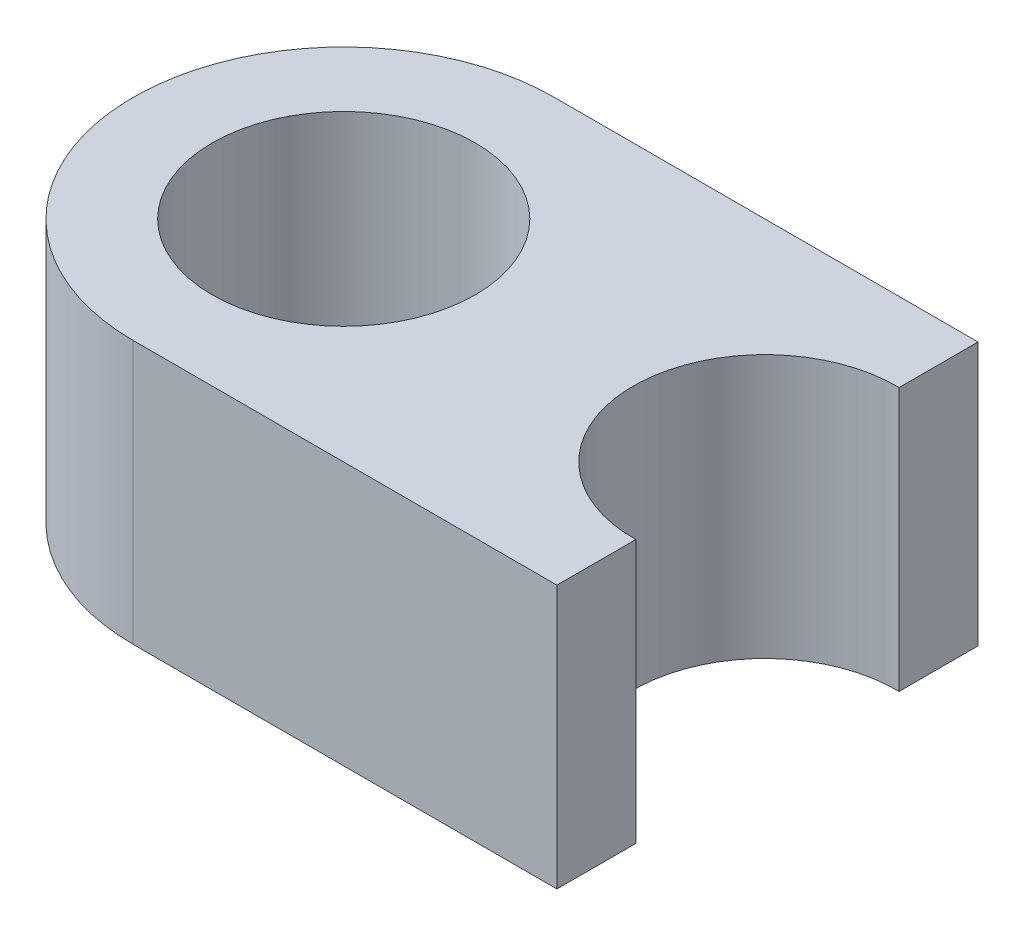
ISO-10303-21;
HEADER;
FILE_DESCRIPTION(('STEP AP214'),'2;1');
FILE_NAME('part.step','',(''),(''),'','','');
FILE_SCHEMA(('AUTOMOTIVE_DESIGN { 1 0 10303 214 1 1 1 1 }'));
ENDSEC;
DATA;
#1=APPLICATION_CONTEXT('core data for automotive mechanical design processes');
#2=APPLICATION_PROTOCOL_DEFINITION('international standard','automotive_design',2000,#1);
#3=PRODUCT_CONTEXT('',#1,'mechanical');
#4=PRODUCT('Part','Part','',(#3));
#5=PRODUCT_RELATED_PRODUCT_CATEGORY('part','',(#4));
#6=PRODUCT_DEFINITION_FORMATION('','',#4);
#7=PRODUCT_DEFINITION_CONTEXT('part definition',#1,'design');
#8=PRODUCT_DEFINITION('design','',#6,#7);
#9=PRODUCT_DEFINITION_SHAPE('','',#8);
#10=(LENGTH_UNIT() NAMED_UNIT(*) SI_UNIT(.MILLI.,.METRE.));
#11=(NAMED_UNIT(*) PLANE_ANGLE_UNIT() SI_UNIT($,.RADIAN.));
#12=(NAMED_UNIT(*) SI_UNIT($,.STERADIAN.) SOLID_ANGLE_UNIT());
#13=UNCERTAINTY_MEASURE_WITH_UNIT(LENGTH_MEASURE(1.E-05),#10,'distance_accuracy_value','');
#14=(GEOMETRIC_REPRESENTATION_CONTEXT(3) GLOBAL_UNCERTAINTY_ASSIGNED_CONTEXT((#13)) GLOBAL_UNIT_ASSIGNED_CONTEXT((#10,
#11,#12)) REPRESENTATION_CONTEXT('',''));
#15=CARTESIAN_POINT('',(0.,0.,0.));
#16=DIRECTION('',(0.,0.,1.));
#17=DIRECTION('',(1.,0.,0.));
#18=AXIS2_PLACEMENT_3D('',#15,#16,#17);
#19=CARTESIAN_POINT('',(21.,0.5,-26.270100010002));
#20=DIRECTION('',(1.,0.,0.));
#21=DIRECTION('',(0.,0.,-1.));
#22=AXIS2_PLACEMENT_3D('',#19,#20,#21);
#23=PLANE('',#22);
#24=DIRECTION('',(0.,0.,1.));
#25=VECTOR('',#24,1.);
#26=CARTESIAN_POINT('',(21.,-0.500000044703484,-0.5));
#27=LINE('',#26,#25);
#28=CARTESIAN_POINT('',(21.,-0.500000044703484,-25.9700625024416));
#29=VERTEX_POINT('',#28);
#30=CARTESIAN_POINT('',(21.,-0.500000044703484,-26.270100010002));
#31=VERTEX_POINT('',#30);
#32=EDGE_CURVE('E157',#29,#31,#27,.F.);
#33=ORIENTED_EDGE('',*,*,#32,.T.);
#34=DIRECTION('',(0.,-1.,0.));
#35=VECTOR('',#34,1.);
#36=CARTESIAN_POINT('',(21.,0.5,-26.270100010002));
#37=LINE('',#36,#35);
#38=CARTESIAN_POINT('',(21.,0.5,-26.270100010002));
#39=VERTEX_POINT('',#38);
#40=EDGE_CURVE('E90',#31,#39,#37,.F.);
#41=ORIENTED_EDGE('',*,*,#40,.T.);
#42=DIRECTION('',(0.,0.,1.));
#43=VECTOR('',#42,1.);
#44=CARTESIAN_POINT('',(21.,0.5,-0.5));
#45=LINE('',#44,#43);
#46=CARTESIAN_POINT('',(21.,0.5,-25.9700625024416));
#47=VERTEX_POINT('',#46);
#48=EDGE_CURVE('E87',#47,#39,#45,.F.);
#49=ORIENTED_EDGE('',*,*,#48,.F.);
#50=DIRECTION('',(0.,1.,0.));
#51=VECTOR('',#50,1.);
#52=CARTESIAN_POINT('',(21.,-2.23517420392706E-08,-25.9700625024416));
#53=LINE('',#52,#51);
#54=EDGE_CURVE('E78',#29,#47,#53,.T.);
#55=ORIENTED_EDGE('',*,*,#54,.F.);
#56=EDGE_LOOP('',(#33,#41,#49,#55));
#57=FACE_BOUND('',#56,.T.);
#58=ADVANCED_FACE('F17',(#57),#23,.T.);
#59=CARTESIAN_POINT('',(20.9899999999998,0.5,-26.77));
#60=DIRECTION('',(0.,-1.,0.));
#61=DIRECTION('',(0.,0.,-1.));
#62=AXIS2_PLACEMENT_3D('',#59,#60,#61);
#63=CYLINDRICAL_SURFACE('',#62,0.5);
#64=ORIENTED_EDGE('',*,*,#40,.F.);
#65=CARTESIAN_POINT('',(20.9899999999998,-0.500000044703484,-26.77));
#66=DIRECTION('',(0.,-1.,0.));
#67=DIRECTION('',(0.,0.,-1.));
#68=AXIS2_PLACEMENT_3D('',#65,#66,#67);
#69=CIRCLE('',#68,0.5);
#70=CARTESIAN_POINT('',(21.,-0.500000044703484,-27.269899989998));
#71=VERTEX_POINT('',#70);
#72=EDGE_CURVE('E133',#31,#71,#69,.T.);
#73=ORIENTED_EDGE('',*,*,#72,.T.);
#74=DIRECTION('',(0.,1.,0.));
#75=VECTOR('',#74,1.);
#76=CARTESIAN_POINT('',(21.,0.5,-27.269899989998));
#77=LINE('',#76,#75);
#78=CARTESIAN_POINT('',(21.,0.5,-27.269899989998));
#79=VERTEX_POINT('',#78);
#80=EDGE_CURVE('E103',#79,#71,#77,.F.);
#81=ORIENTED_EDGE('',*,*,#80,.F.);
#82=CARTESIAN_POINT('',(20.9899999999998,0.5,-26.77));
#83=DIRECTION('',(0.,-1.,0.));
#84=DIRECTION('',(0.,0.,-1.));
#85=AXIS2_PLACEMENT_3D('',#82,#83,#84);
#86=CIRCLE('',#85,0.5);
#87=EDGE_CURVE('E92',#39,#79,#86,.T.);
#88=ORIENTED_EDGE('',*,*,#87,.F.);
#89=EDGE_LOOP('',(#64,#73,#81,#88));
#90=FACE_BOUND('',#89,.T.);
#91=ADVANCED_FACE('F173',(#90),#63,.F.);
#92=CARTESIAN_POINT('',(21.,0.5,-27.5699374975584));
#93=DIRECTION('',(1.,0.,0.));
#94=DIRECTION('',(0.,0.,-1.));
#95=AXIS2_PLACEMENT_3D('',#92,#93,#94);
#96=PLANE('',#95);
#97=DIRECTION('',(0.,0.,1.));
#98=VECTOR('',#97,1.);
#99=CARTESIAN_POINT('',(21.,-0.500000044703484,-0.5));
#100=LINE('',#99,#98);
#101=CARTESIAN_POINT('',(21.,-0.500000044703484,-27.5699374975584));
#102=VERTEX_POINT('',#101);
#103=EDGE_CURVE('E132',#71,#102,#100,.F.);
#104=ORIENTED_EDGE('',*,*,#103,.T.);
#105=DIRECTION('',(0.,-1.,0.));
#106=VECTOR('',#105,1.);
#107=CARTESIAN_POINT('',(21.,-2.23517420392706E-08,-27.5699374975584));
#108=LINE('',#107,#106);
#109=CARTESIAN_POINT('',(21.,0.5,-27.5699374975584));
#110=VERTEX_POINT('',#109);
#111=EDGE_CURVE('E101',#110,#102,#108,.T.);
#112=ORIENTED_EDGE('',*,*,#111,.F.);
#113=DIRECTION('',(0.,0.,1.));
#114=VECTOR('',#113,1.);
#115=CARTESIAN_POINT('',(21.,0.5,-0.5));
#116=LINE('',#115,#114);
#117=EDGE_CURVE('E94',#79,#110,#116,.F.);
#118=ORIENTED_EDGE('',*,*,#117,.F.);
#119=ORIENTED_EDGE('',*,*,#80,.T.);
#120=EDGE_LOOP('',(#104,#112,#118,#119));
#121=FACE_BOUND('',#120,.T.);
#122=ADVANCED_FACE('F142',(#121),#96,.T.);
#123=CARTESIAN_POINT('',(19.3899999999998,0.5,-27.57));
#124=CARTESIAN_POINT('',(19.3899999999998,-0.500000044703484,-27.57));
#125=CARTESIAN_POINT('',(19.9233333333333,0.5,-27.57));
#126=CARTESIAN_POINT('',(19.9233333333333,-0.500000044703484,-27.57));
#127=CARTESIAN_POINT('',(20.4566666666667,0.5,-27.57));
#128=CARTESIAN_POINT('',(20.4566666666667,-0.500000044703484,-27.57));
#129=CARTESIAN_POINT('',(20.99,0.5,-27.57));
#130=CARTESIAN_POINT('',(20.99,-0.500000044703484,-27.57));
#131=CARTESIAN_POINT('',(20.993333420145,0.5,-27.57));
#132=CARTESIAN_POINT('',(20.993333420145,-0.500000044703484,-27.57));
#133=CARTESIAN_POINT('',(20.9966668402886,0.5,-27.5699791653102));
#134=CARTESIAN_POINT('',(20.9966668402886,-0.500000044703484,-27.5699791653102));
#135=CARTESIAN_POINT('',(21.,0.5,-27.5699374975584));
#136=CARTESIAN_POINT('',(21.,-0.500000044703484,-27.5699374975584));
#137=B_SPLINE_SURFACE_WITH_KNOTS('',3,1,((#123,#124),(#125,#126),(#127,#128),(#129,#130),(#131,
#132),(#133,#134),(#135,#136)),.UNSPECIFIED.,.F.,.F.,.F.,(4,3,4),(2,2),(-3.14319265358979,
-3.14159265358979,-3.12909232804607),(0.,0.100000004470348),.UNSPECIFIED.);
#138=CARTESIAN_POINT('',(21.,-0.500000044703484,-27.5699374975584));
#139=CARTESIAN_POINT('',(20.9989584284689,-0.500000044703484,-27.5699507410931));
#140=CARTESIAN_POINT('',(20.9979168272473,-0.500000044703484,-27.569961616041));
#141=CARTESIAN_POINT('',(20.9958335898361,-0.500000044703484,-27.5699792971772));
#142=CARTESIAN_POINT('',(20.9947919536463,-0.500000044703484,-27.5699861033656));
#143=CARTESIAN_POINT('',(20.9895837211778,-0.500000044703484,-27.5700116335663));
#144=CARTESIAN_POINT('',(20.9854170457304,-0.500000044703484,-27.5700048546577));
#145=CARTESIAN_POINT('',(20.9645838433177,-0.500000044703485,-27.5699805815232));
#146=CARTESIAN_POINT('',(20.9479174438846,-0.500000044703484,-27.5699919505702));
#147=CARTESIAN_POINT('',(20.8645853733804,-0.500000044703483,-27.570032197719));
#148=CARTESIAN_POINT('',(20.7979194822936,-0.500000044703483,-27.5700112815619));
#149=CARTESIAN_POINT('',(20.5979218948281,-0.500000044703485,-27.5699774368692));
#150=CARTESIAN_POINT('',(20.4645903261607,-0.500000044703484,-27.569993412144));
#151=CARTESIAN_POINT('',(20.1979271897022,-0.500000044703484,-27.5700065878519));
#152=CARTESIAN_POINT('',(20.0645956219112,-0.500000044703484,-27.5700037882968));
#153=CARTESIAN_POINT('',(19.750842677184,-0.500000044703484,-27.5699948737595));
#154=CARTESIAN_POINT('',(19.5704212966169,-0.500000044703484,-27.5699879370427));
#155=CARTESIAN_POINT('',(19.3899999999998,-0.500000044703484,-27.57));
#156=B_SPLINE_CURVE_WITH_KNOTS('',3,(#138,#139,#140,#141,#142,#143,#144,#145,#146,#147,#148,
#149,#150,#151,#152,#153,#154,#155),.UNSPECIFIED.,.F.,.F.,(4,2,2,2,2,2,2,2,4),(0.,
0.00312496527294574,0.00624993054575144,0.0187498670302222,0.0687492160317463,0.268746612038276,
0.668741529800584,1.06873619606404,1.61000024581576),.UNSPECIFIED.);
#157=CARTESIAN_POINT('',(19.39,-0.500000044703484,-27.57));
#158=VERTEX_POINT('',#157);
#159=EDGE_CURVE('E125',#102,#158,#156,.T.);
#160=DIRECTION('',(0.,-1.,0.));
#161=VECTOR('',#160,1.);
#162=CARTESIAN_POINT('',(19.39,0.5,-27.57));
#163=LINE('',#162,#161);
#164=CARTESIAN_POINT('',(19.3899999999999,0.5,-27.57));
#165=VERTEX_POINT('',#164);
#166=EDGE_CURVE('E98',#165,#158,#163,.T.);
#167=CARTESIAN_POINT('',(21.,0.5,-27.5699374975584));
#168=CARTESIAN_POINT('',(20.9989584284689,0.5,-27.5699507410931));
#169=CARTESIAN_POINT('',(20.9979168272473,0.5,-27.569961616041));
#170=CARTESIAN_POINT('',(20.9958335898361,0.5,-27.5699792971772));
#171=CARTESIAN_POINT('',(20.9947919536463,0.5,-27.5699861033656));
#172=CARTESIAN_POINT('',(20.9895837211778,0.5,-27.5700116335663));
#173=CARTESIAN_POINT('',(20.9854170457304,0.5,-27.5700048546577));
#174=CARTESIAN_POINT('',(20.9645838433177,0.5,-27.5699805815232));
#175=CARTESIAN_POINT('',(20.9479174438846,0.5,-27.5699919505702));
#176=CARTESIAN_POINT('',(20.8645853733804,0.5,-27.570032197719));
#177=CARTESIAN_POINT('',(20.7979194822936,0.5,-27.5700112815619));
#178=CARTESIAN_POINT('',(20.5979218948281,0.5,-27.5699774368692));
#179=CARTESIAN_POINT('',(20.4645903261607,0.5,-27.569993412144));
#180=CARTESIAN_POINT('',(20.1979271897022,0.5,-27.5700065878519));
#181=CARTESIAN_POINT('',(20.0645956219112,0.5,-27.5700037882968));
#182=CARTESIAN_POINT('',(19.750842677184,0.5,-27.5699948737595));
#183=CARTESIAN_POINT('',(19.5704212966169,0.5,-27.5699879370427));
#184=CARTESIAN_POINT('',(19.3899999999998,0.5,-27.57));
#185=B_SPLINE_CURVE_WITH_KNOTS('',3,(#167,#168,#169,#170,#171,#172,#173,#174,#175,#176,#177,
#178,#179,#180,#181,#182,#183,#184),.UNSPECIFIED.,.F.,.F.,(4,2,2,2,2,2,2,2,4),(0.,
0.00312496527294574,0.00624993054575144,0.0187498670302222,0.0687492160317463,0.268746612038276,
0.668741529800584,1.06873619606404,1.61000024581576),.UNSPECIFIED.);
#186=EDGE_CURVE('E152',#110,#165,#185,.T.);
#187=ORIENTED_EDGE('',*,*,#159,.T.);
#188=ORIENTED_EDGE('',*,*,#166,.F.);
#189=ORIENTED_EDGE('',*,*,#186,.F.);
#190=ORIENTED_EDGE('',*,*,#111,.T.);
#191=EDGE_LOOP('',(#187,#188,#189,#190));
#192=FACE_BOUND('',#191,.T.);
#193=ADVANCED_FACE('F135',(#192),#137,.T.);
#194=CARTESIAN_POINT('',(19.39,0.5,-26.77));
#195=DIRECTION('',(0.,-1.,0.));
#196=DIRECTION('',(0.,0.,-1.));
#197=AXIS2_PLACEMENT_3D('',#194,#195,#196);
#198=CYLINDRICAL_SURFACE('',#197,0.799999999999999);
#199=CARTESIAN_POINT('',(19.39,-0.500000044703484,-26.77));
#200=DIRECTION('',(0.,-1.,0.));
#201=DIRECTION('',(0.,0.,-1.));
#202=AXIS2_PLACEMENT_3D('',#199,#200,#201);
#203=CIRCLE('',#202,0.799999999999999);
#204=CARTESIAN_POINT('',(19.39,-0.500000044703484,-25.97));
#205=VERTEX_POINT('',#204);
#206=EDGE_CURVE('E114',#158,#205,#203,.F.);
#207=ORIENTED_EDGE('',*,*,#206,.T.);
#208=DIRECTION('',(0.,-1.,0.));
#209=VECTOR('',#208,1.);
#210=CARTESIAN_POINT('',(19.39,-2.23517420392706E-08,-25.97));
#211=LINE('',#210,#209);
#212=CARTESIAN_POINT('',(19.39,0.5,-25.97));
#213=VERTEX_POINT('',#212);
#214=EDGE_CURVE('E44',#213,#205,#211,.T.);
#215=ORIENTED_EDGE('',*,*,#214,.F.);
#216=CARTESIAN_POINT('',(19.39,0.5,-26.77));
#217=DIRECTION('',(0.,-1.,0.));
#218=DIRECTION('',(0.,0.,-1.));
#219=AXIS2_PLACEMENT_3D('',#216,#217,#218);
#220=CIRCLE('',#219,0.799999999999999);
#221=EDGE_CURVE('E89',#165,#213,#220,.F.);
#222=ORIENTED_EDGE('',*,*,#221,.F.);
#223=ORIENTED_EDGE('',*,*,#166,.T.);
#224=EDGE_LOOP('',(#207,#215,#222,#223));
#225=FACE_BOUND('',#224,.T.);
#226=ADVANCED_FACE('F141',(#225),#198,.T.);
#227=CARTESIAN_POINT('',(21.,0.5,-25.9700625024416));
#228=CARTESIAN_POINT('',(21.,-0.500000044703484,-25.9700625024416));
#229=CARTESIAN_POINT('',(20.9966668402886,0.5,-25.9700208346898));
#230=CARTESIAN_POINT('',(20.9966668402886,-0.500000044703484,-25.9700208346898));
#231=CARTESIAN_POINT('',(20.993333420145,0.5,-25.97));
#232=CARTESIAN_POINT('',(20.993333420145,-0.500000044703484,-25.97));
#233=CARTESIAN_POINT('',(20.99,0.5,-25.97));
#234=CARTESIAN_POINT('',(20.99,-0.500000044703484,-25.97));
#235=CARTESIAN_POINT('',(20.4566666666667,0.5,-25.97));
#236=CARTESIAN_POINT('',(20.4566666666667,-0.500000044703484,-25.97));
#237=CARTESIAN_POINT('',(19.9233333333333,0.5,-25.97));
#238=CARTESIAN_POINT('',(19.9233333333333,-0.500000044703484,-25.97));
#239=CARTESIAN_POINT('',(19.39,0.5,-25.97));
#240=CARTESIAN_POINT('',(19.39,-0.500000044703484,-25.97));
#241=B_SPLINE_SURFACE_WITH_KNOTS('',3,1,((#227,#228),(#229,#230),(#231,#232),(#233,#234),(#235,
#236),(#237,#238),(#239,#240)),.UNSPECIFIED.,.F.,.F.,.F.,(4,3,4),(2,2),(-0.0125003255438958,
-1.73472347597681E-13,0.00159999999982653),(0.,0.100000004470348),.UNSPECIFIED.);
#242=CARTESIAN_POINT('',(19.39,-0.500000044703484,-25.97));
#243=CARTESIAN_POINT('',(19.6583333242738,-0.500000044703486,-25.970000345457));
#244=CARTESIAN_POINT('',(19.9266666636468,-0.500000044703485,-25.9700001151523));
#245=CARTESIAN_POINT('',(20.3291666681766,-0.500000044703484,-25.9699999424238));
#246=CARTESIAN_POINT('',(20.4633333355982,-0.500000044703484,-25.9699999136358));
#247=CARTESIAN_POINT('',(20.6645833322009,-0.500000044703484,-25.9700000431821));
#248=CARTESIAN_POINT('',(20.7316666636468,-0.500000044703485,-25.9700001151523));
#249=CARTESIAN_POINT('',(20.8322916681766,-0.500000044703484,-25.9699999424238));
#250=CARTESIAN_POINT('',(20.86583333758,-0.500000044703484,-25.969999838067));
#251=CARTESIAN_POINT('',(20.91614583121,-0.500000044703484,-25.9700000809665));
#252=CARTESIAN_POINT('',(20.9329166606742,-0.500000044703484,-25.9700002285054));
#253=CARTESIAN_POINT('',(20.9580729196629,-0.500000044703484,-25.9699998857473));
#254=CARTESIAN_POINT('',(20.9664583417912,-0.500000044703484,-25.9699996774835));
#255=CARTESIAN_POINT('',(20.9790364541044,-0.500000044703484,-25.9700001612582));
#256=CARTESIAN_POINT('',(20.9832291547289,-0.500000044703484,-25.9700004552115));
#257=CARTESIAN_POINT('',(20.9895182370988,-0.500000044703484,-25.969999772394));
#258=CARTESIAN_POINT('',(20.9916146041092,-0.500000044703484,-25.9699993574964));
#259=CARTESIAN_POINT('',(20.9947591356282,-0.500000044703484,-25.9700132318925));
#260=CARTESIAN_POINT('',(20.9958073253509,-0.500000044703484,-25.9700202730291));
#261=CARTESIAN_POINT('',(20.9979036856841,-0.500000044703484,-25.9700384755718));
#262=CARTESIAN_POINT('',(20.9989518562939,-0.500000044703484,-25.9700496370415));
#263=CARTESIAN_POINT('',(21.,-0.500000044703484,-25.9700625024416));
#264=B_SPLINE_CURVE_WITH_KNOTS('',3,(#242,#243,#244,#245,#246,#247,#248,#249,#250,#251,#252,
#253,#254,#255,#256,#257,#258,#259,#260,#261,#262,#263),.UNSPECIFIED.,.F.,.F.,(4,2,2,2,2,2,2,2,
2,2,4),(0.,0.804999999999997,1.2075,1.40875,1.509375,1.5596875,1.58484375,1.597421875,
1.60371094338962,1.60685557188374,1.61000024896673),.UNSPECIFIED.);
#265=EDGE_CURVE('E80',#205,#29,#264,.T.);
#266=CARTESIAN_POINT('',(19.39,0.5,-25.97));
#267=CARTESIAN_POINT('',(19.6583333242738,0.499999999999999,-25.9700003454569));
#268=CARTESIAN_POINT('',(19.9266666636468,0.5,-25.9700001151523));
#269=CARTESIAN_POINT('',(20.3291666681766,0.5,-25.9699999424238));
#270=CARTESIAN_POINT('',(20.4633333355982,0.5,-25.9699999136358));
#271=CARTESIAN_POINT('',(20.6645833322009,0.5,-25.9700000431821));
#272=CARTESIAN_POINT('',(20.7316666636468,0.5,-25.9700001151523));
#273=CARTESIAN_POINT('',(20.8322916681766,0.5,-25.9699999424238));
#274=CARTESIAN_POINT('',(20.86583333758,0.5,-25.9699998380671));
#275=CARTESIAN_POINT('',(20.91614583121,0.5,-25.9700000809665));
#276=CARTESIAN_POINT('',(20.9329166606742,0.5,-25.9700002285054));
#277=CARTESIAN_POINT('',(20.9580729196629,0.5,-25.9699998857473));
#278=CARTESIAN_POINT('',(20.9664583417912,0.5,-25.9699996774835));
#279=CARTESIAN_POINT('',(20.9790364541044,0.5,-25.9700001612582));
#280=CARTESIAN_POINT('',(20.9832291547289,0.5,-25.9700004552115));
#281=CARTESIAN_POINT('',(20.9895182370988,0.5,-25.969999772394));
#282=CARTESIAN_POINT('',(20.9916146041092,0.5,-25.9699993574965));
#283=CARTESIAN_POINT('',(20.9947591356282,0.5,-25.9700132318925));
#284=CARTESIAN_POINT('',(20.9958073253509,0.5,-25.9700202730291));
#285=CARTESIAN_POINT('',(20.9979036856841,0.5,-25.9700384755718));
#286=CARTESIAN_POINT('',(20.9989518562939,0.5,-25.9700496370415));
#287=CARTESIAN_POINT('',(21.,0.5,-25.9700625024416));
#288=B_SPLINE_CURVE_WITH_KNOTS('',3,(#266,#267,#268,#269,#270,#271,#272,#273,#274,#275,#276,
#277,#278,#279,#280,#281,#282,#283,#284,#285,#286,#287),.UNSPECIFIED.,.F.,.F.,(4,2,2,2,2,2,2,2,
2,2,4),(0.,0.804999999999997,1.2075,1.40875,1.509375,1.5596875,1.58484374999999,1.597421875,
1.60371094338962,1.60685557188374,1.61000024896673),.UNSPECIFIED.);
#289=EDGE_CURVE('E24',#213,#47,#288,.T.);
#290=ORIENTED_EDGE('',*,*,#265,.T.);
#291=ORIENTED_EDGE('',*,*,#54,.T.);
#292=ORIENTED_EDGE('',*,*,#289,.F.);
#293=ORIENTED_EDGE('',*,*,#214,.T.);
#294=EDGE_LOOP('',(#290,#291,#292,#293));
#295=FACE_BOUND('',#294,.T.);
#296=ADVANCED_FACE('F19',(#295),#241,.T.);
#297=CARTESIAN_POINT('',(20.5,0.5,-0.5));
#298=DIRECTION('',(0.,1.,0.));
#299=DIRECTION('',(0.,0.,1.));
#300=AXIS2_PLACEMENT_3D('',#297,#298,#299);
#301=PLANE('',#300);
#302=CARTESIAN_POINT('',(19.3899999999998,0.5,-26.77));
#303=DIRECTION('',(0.,-1.,0.));
#304=DIRECTION('',(0.,0.,-1.));
#305=AXIS2_PLACEMENT_3D('',#302,#303,#304);
#306=CIRCLE('',#305,0.5);
#307=CARTESIAN_POINT('',(19.3899999999998,0.5,-27.27));
#308=VERTEX_POINT('',#307);
#309=EDGE_CURVE('E35',#308,#308,#306,.T.);
#310=ORIENTED_EDGE('',*,*,#309,.T.);
#311=EDGE_LOOP('',(#310));
#312=FACE_BOUND('',#311,.T.);
#313=ORIENTED_EDGE('',*,*,#186,.T.);
#314=ORIENTED_EDGE('',*,*,#221,.T.);
#315=ORIENTED_EDGE('',*,*,#289,.T.);
#316=ORIENTED_EDGE('',*,*,#48,.T.);
#317=ORIENTED_EDGE('',*,*,#87,.T.);
#318=ORIENTED_EDGE('',*,*,#117,.T.);
#319=EDGE_LOOP('',(#313,#314,#315,#316,#317,#318));
#320=FACE_BOUND('',#319,.T.);
#321=ADVANCED_FACE('F86',(#312,#320),#301,.T.);
#322=CARTESIAN_POINT('',(20.5,-0.500000044703484,-0.5));
#323=DIRECTION('',(0.,1.,0.));
#324=DIRECTION('',(0.,0.,1.));
#325=AXIS2_PLACEMENT_3D('',#322,#323,#324);
#326=PLANE('',#325);
#327=CARTESIAN_POINT('',(19.3899999999998,-0.500000044703484,-26.77));
#328=DIRECTION('',(0.,-1.,0.));
#329=DIRECTION('',(0.,0.,-1.));
#330=AXIS2_PLACEMENT_3D('',#327,#328,#329);
#331=CIRCLE('',#330,0.5);
#332=CARTESIAN_POINT('',(19.3899999999998,-0.500000044703484,-27.27));
#333=VERTEX_POINT('',#332);
#334=EDGE_CURVE('E11',#333,#333,#331,.F.);
#335=ORIENTED_EDGE('',*,*,#334,.T.);
#336=EDGE_LOOP('',(#335));
#337=FACE_BOUND('',#336,.T.);
#338=ORIENTED_EDGE('',*,*,#206,.F.);
#339=ORIENTED_EDGE('',*,*,#159,.F.);
#340=ORIENTED_EDGE('',*,*,#103,.F.);
#341=ORIENTED_EDGE('',*,*,#72,.F.);
#342=ORIENTED_EDGE('',*,*,#32,.F.);
#343=ORIENTED_EDGE('',*,*,#265,.F.);
#344=EDGE_LOOP('',(#338,#339,#340,#341,#342,#343));
#345=FACE_BOUND('',#344,.T.);
#346=ADVANCED_FACE('F116',(#337,#345),#326,.F.);
#347=CARTESIAN_POINT('',(19.3899999999998,0.5,-26.77));
#348=DIRECTION('',(0.,-1.,0.));
#349=DIRECTION('',(0.,0.,-1.));
#350=AXIS2_PLACEMENT_3D('',#347,#348,#349);
#351=CYLINDRICAL_SURFACE('',#350,0.5);
#352=ORIENTED_EDGE('',*,*,#309,.F.);
#353=EDGE_LOOP('',(#352));
#354=FACE_BOUND('',#353,.T.);
#355=ORIENTED_EDGE('',*,*,#334,.F.);
#356=EDGE_LOOP('',(#355));
#357=FACE_BOUND('',#356,.T.);
#358=ADVANCED_FACE('F120',(#354,#357),#351,.F.);
#359=CLOSED_SHELL('',(#58,#91,#122,#193,#226,#296,#321,#346,#358));
#360=MANIFOLD_SOLID_BREP('B1',#359);
#361=ADVANCED_BREP_SHAPE_REPRESENTATION('',(#18,#360),#14);
#362=SHAPE_DEFINITION_REPRESENTATION(#9,#361);
ENDSEC;
END-ISO-10303-21;
